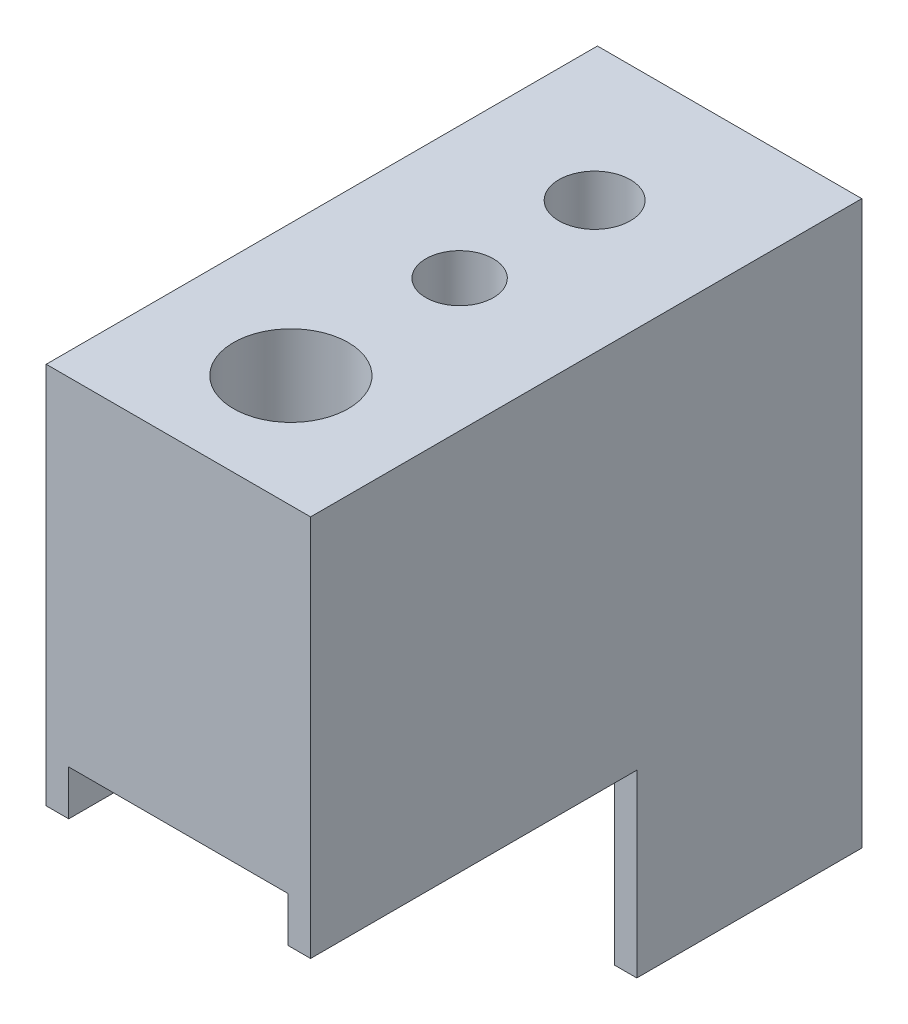
ISO-10303-21;
HEADER;
FILE_DESCRIPTION(('STEP AP214'),'2;1');
FILE_NAME('part.step','',(''),(''),'','','');
FILE_SCHEMA(('AUTOMOTIVE_DESIGN { 1 0 10303 214 1 1 1 1 }'));
ENDSEC;
DATA;
#1=APPLICATION_CONTEXT('core data for automotive mechanical design processes');
#2=APPLICATION_PROTOCOL_DEFINITION('international standard','automotive_design',2000,#1);
#3=PRODUCT_CONTEXT('',#1,'mechanical');
#4=PRODUCT('Part','Part','',(#3));
#5=PRODUCT_RELATED_PRODUCT_CATEGORY('part','',(#4));
#6=PRODUCT_DEFINITION_FORMATION('','',#4);
#7=PRODUCT_DEFINITION_CONTEXT('part definition',#1,'design');
#8=PRODUCT_DEFINITION('design','',#6,#7);
#9=PRODUCT_DEFINITION_SHAPE('','',#8);
#10=(LENGTH_UNIT() NAMED_UNIT(*) SI_UNIT(.MILLI.,.METRE.));
#11=(NAMED_UNIT(*) PLANE_ANGLE_UNIT() SI_UNIT($,.RADIAN.));
#12=(NAMED_UNIT(*) SI_UNIT($,.STERADIAN.) SOLID_ANGLE_UNIT());
#13=UNCERTAINTY_MEASURE_WITH_UNIT(LENGTH_MEASURE(1.E-05),#10,'distance_accuracy_value','');
#14=(GEOMETRIC_REPRESENTATION_CONTEXT(3) GLOBAL_UNCERTAINTY_ASSIGNED_CONTEXT((#13)) GLOBAL_UNIT_ASSIGNED_CONTEXT((#10,
#11,#12)) REPRESENTATION_CONTEXT('',''));
#15=CARTESIAN_POINT('',(0.,0.,0.));
#16=DIRECTION('',(0.,0.,1.));
#17=DIRECTION('',(1.,0.,0.));
#18=AXIS2_PLACEMENT_3D('',#15,#16,#17);
#19=CARTESIAN_POINT('',(9.75,0.,44.));
#20=DIRECTION('',(0.,0.,-1.));
#21=DIRECTION('',(-1.,0.,0.));
#22=AXIS2_PLACEMENT_3D('',#19,#20,#21);
#23=PLANE('',#22);
#24=DIRECTION('',(-1.,0.,0.));
#25=VECTOR('',#24,1.);
#26=CARTESIAN_POINT('',(9.75,30.,44.));
#27=LINE('',#26,#25);
#28=CARTESIAN_POINT('',(11.75,30.,44.));
#29=VERTEX_POINT('',#28);
#30=CARTESIAN_POINT('',(-11.75,30.,44.));
#31=VERTEX_POINT('',#30);
#32=EDGE_CURVE('E142',#29,#31,#27,.T.);
#33=ORIENTED_EDGE('',*,*,#32,.T.);
#34=DIRECTION('',(0.,-1.,0.));
#35=VECTOR('',#34,1.);
#36=CARTESIAN_POINT('',(-11.75,30.,44.));
#37=LINE('',#36,#35);
#38=CARTESIAN_POINT('',(-11.75,-4.,44.));
#39=VERTEX_POINT('',#38);
#40=EDGE_CURVE('E134',#31,#39,#37,.T.);
#41=ORIENTED_EDGE('',*,*,#40,.T.);
#42=DIRECTION('',(1.,0.,0.));
#43=VECTOR('',#42,1.);
#44=CARTESIAN_POINT('',(-11.75,-4.,44.));
#45=LINE('',#44,#43);
#46=CARTESIAN_POINT('',(-9.75,-4.,44.));
#47=VERTEX_POINT('',#46);
#48=EDGE_CURVE('E117',#39,#47,#45,.T.);
#49=ORIENTED_EDGE('',*,*,#48,.T.);
#50=DIRECTION('',(0.,-1.,0.));
#51=VECTOR('',#50,1.);
#52=CARTESIAN_POINT('',(-9.75,30.,44.));
#53=LINE('',#52,#51);
#54=CARTESIAN_POINT('',(-9.75,0.,44.));
#55=VERTEX_POINT('',#54);
#56=EDGE_CURVE('E157',#55,#47,#53,.T.);
#57=ORIENTED_EDGE('',*,*,#56,.F.);
#58=DIRECTION('',(-1.,0.,0.));
#59=VECTOR('',#58,1.);
#60=CARTESIAN_POINT('',(9.75,0.,44.));
#61=LINE('',#60,#59);
#62=CARTESIAN_POINT('',(9.75,0.,44.));
#63=VERTEX_POINT('',#62);
#64=EDGE_CURVE('E11',#63,#55,#61,.T.);
#65=ORIENTED_EDGE('',*,*,#64,.F.);
#66=DIRECTION('',(0.,-1.,0.));
#67=VECTOR('',#66,1.);
#68=CARTESIAN_POINT('',(9.75,30.,44.));
#69=LINE('',#68,#67);
#70=CARTESIAN_POINT('',(9.75,-4.,44.));
#71=VERTEX_POINT('',#70);
#72=EDGE_CURVE('E170',#63,#71,#69,.T.);
#73=ORIENTED_EDGE('',*,*,#72,.T.);
#74=DIRECTION('',(-1.,0.,0.));
#75=VECTOR('',#74,1.);
#76=CARTESIAN_POINT('',(11.75,-4.,44.));
#77=LINE('',#76,#75);
#78=CARTESIAN_POINT('',(11.75,-4.,44.));
#79=VERTEX_POINT('',#78);
#80=EDGE_CURVE('E183',#79,#71,#77,.T.);
#81=ORIENTED_EDGE('',*,*,#80,.F.);
#82=DIRECTION('',(0.,-1.,0.));
#83=VECTOR('',#82,1.);
#84=CARTESIAN_POINT('',(11.75,30.,44.));
#85=LINE('',#84,#83);
#86=EDGE_CURVE('E181',#29,#79,#85,.T.);
#87=ORIENTED_EDGE('',*,*,#86,.F.);
#88=EDGE_LOOP('',(#33,#41,#49,#57,#65,#73,#81,#87));
#89=FACE_BOUND('',#88,.T.);
#90=ADVANCED_FACE('F33',(#89),#23,.F.);
#91=CARTESIAN_POINT('',(9.75,0.,44.));
#92=DIRECTION('',(0.,1.,0.));
#93=DIRECTION('',(0.,0.,1.));
#94=AXIS2_PLACEMENT_3D('',#91,#92,#93);
#95=PLANE('',#94);
#96=CARTESIAN_POINT('',(0.,0.,34.));
#97=DIRECTION('',(0.,-1.,0.));
#98=DIRECTION('',(0.,0.,-1.));
#99=AXIS2_PLACEMENT_3D('',#96,#97,#98);
#100=CIRCLE('',#99,5.1);
#101=CARTESIAN_POINT('',(0.,0.,28.9));
#102=VERTEX_POINT('',#101);
#103=EDGE_CURVE('E369',#102,#102,#100,.T.);
#104=ORIENTED_EDGE('',*,*,#103,.F.);
#105=EDGE_LOOP('',(#104));
#106=FACE_BOUND('',#105,.T.);
#107=CARTESIAN_POINT('',(0.,0.,19.));
#108=DIRECTION('',(0.,-1.,0.));
#109=DIRECTION('',(0.,0.,-1.));
#110=AXIS2_PLACEMENT_3D('',#107,#108,#109);
#111=CIRCLE('',#110,3.);
#112=CARTESIAN_POINT('',(0.,0.,16.));
#113=VERTEX_POINT('',#112);
#114=EDGE_CURVE('E374',#113,#113,#111,.T.);
#115=ORIENTED_EDGE('',*,*,#114,.F.);
#116=EDGE_LOOP('',(#115));
#117=FACE_BOUND('',#116,.T.);
#118=CARTESIAN_POINT('',(0.,0.,7.));
#119=DIRECTION('',(0.,-1.,0.));
#120=DIRECTION('',(0.,0.,-1.));
#121=AXIS2_PLACEMENT_3D('',#118,#119,#120);
#122=CIRCLE('',#121,3.175);
#123=CARTESIAN_POINT('',(0.,0.,3.825));
#124=VERTEX_POINT('',#123);
#125=EDGE_CURVE('E381',#124,#124,#122,.T.);
#126=ORIENTED_EDGE('',*,*,#125,.F.);
#127=EDGE_LOOP('',(#126));
#128=FACE_BOUND('',#127,.T.);
#129=DIRECTION('',(0.,0.,-1.));
#130=VECTOR('',#129,1.);
#131=CARTESIAN_POINT('',(-9.75,0.,44.));
#132=LINE('',#131,#130);
#133=CARTESIAN_POINT('',(-9.75,0.,0.));
#134=VERTEX_POINT('',#133);
#135=EDGE_CURVE('E200',#55,#134,#132,.T.);
#136=ORIENTED_EDGE('',*,*,#135,.T.);
#137=DIRECTION('',(-1.,0.,0.));
#138=VECTOR('',#137,1.);
#139=CARTESIAN_POINT('',(9.75,0.,0.));
#140=LINE('',#139,#138);
#141=CARTESIAN_POINT('',(9.75,0.,0.));
#142=VERTEX_POINT('',#141);
#143=EDGE_CURVE('E41',#142,#134,#140,.T.);
#144=ORIENTED_EDGE('',*,*,#143,.F.);
#145=DIRECTION('',(0.,0.,-1.));
#146=VECTOR('',#145,1.);
#147=CARTESIAN_POINT('',(9.75,0.,44.));
#148=LINE('',#147,#146);
#149=EDGE_CURVE('E201',#63,#142,#148,.T.);
#150=ORIENTED_EDGE('',*,*,#149,.F.);
#151=ORIENTED_EDGE('',*,*,#64,.T.);
#152=EDGE_LOOP('',(#136,#144,#150,#151));
#153=FACE_BOUND('',#152,.T.);
#154=ADVANCED_FACE('F224',(#106,#117,#128,#153),#95,.F.);
#155=CARTESIAN_POINT('',(9.75,0.,0.));
#156=DIRECTION('',(0.,0.,-1.));
#157=DIRECTION('',(0.,1.,0.));
#158=AXIS2_PLACEMENT_3D('',#155,#156,#157);
#159=PLANE('',#158);
#160=DIRECTION('',(0.,-1.,0.));
#161=VECTOR('',#160,1.);
#162=CARTESIAN_POINT('',(-9.75,0.,0.));
#163=LINE('',#162,#161);
#164=CARTESIAN_POINT('',(-9.75,-20.,0.));
#165=VERTEX_POINT('',#164);
#166=EDGE_CURVE('E205',#134,#165,#163,.T.);
#167=ORIENTED_EDGE('',*,*,#166,.T.);
#168=DIRECTION('',(-1.,0.,0.));
#169=VECTOR('',#168,1.);
#170=CARTESIAN_POINT('',(9.75,-20.,0.));
#171=LINE('',#170,#169);
#172=CARTESIAN_POINT('',(9.75,-20.,0.));
#173=VERTEX_POINT('',#172);
#174=EDGE_CURVE('E216',#173,#165,#171,.T.);
#175=ORIENTED_EDGE('',*,*,#174,.F.);
#176=DIRECTION('',(0.,-1.,0.));
#177=VECTOR('',#176,1.);
#178=CARTESIAN_POINT('',(9.75,0.,0.));
#179=LINE('',#178,#177);
#180=EDGE_CURVE('E204',#142,#173,#179,.T.);
#181=ORIENTED_EDGE('',*,*,#180,.F.);
#182=ORIENTED_EDGE('',*,*,#143,.T.);
#183=EDGE_LOOP('',(#167,#175,#181,#182));
#184=FACE_BOUND('',#183,.T.);
#185=ADVANCED_FACE('F219',(#184),#159,.F.);
#186=CARTESIAN_POINT('',(9.75,-20.,-5.));
#187=DIRECTION('',(0.,1.,0.));
#188=DIRECTION('',(0.,0.,1.));
#189=AXIS2_PLACEMENT_3D('',#186,#187,#188);
#190=PLANE('',#189);
#191=ORIENTED_EDGE('',*,*,#174,.T.);
#192=DIRECTION('',(0.,0.,-1.));
#193=VECTOR('',#192,1.);
#194=CARTESIAN_POINT('',(-9.75,-20.,14.9999999999721));
#195=LINE('',#194,#193);
#196=CARTESIAN_POINT('',(-9.75,-20.,14.9999999999721));
#197=VERTEX_POINT('',#196);
#198=EDGE_CURVE('E160',#197,#165,#195,.T.);
#199=ORIENTED_EDGE('',*,*,#198,.F.);
#200=DIRECTION('',(1.,0.,0.));
#201=VECTOR('',#200,1.);
#202=CARTESIAN_POINT('',(-11.75,-20.,14.9999999999721));
#203=LINE('',#202,#201);
#204=CARTESIAN_POINT('',(-11.75,-20.,14.9999999999721));
#205=VERTEX_POINT('',#204);
#206=EDGE_CURVE('E128',#205,#197,#203,.T.);
#207=ORIENTED_EDGE('',*,*,#206,.F.);
#208=DIRECTION('',(0.,0.,-1.));
#209=VECTOR('',#208,1.);
#210=CARTESIAN_POINT('',(-11.75,-20.,14.9999999999721));
#211=LINE('',#210,#209);
#212=CARTESIAN_POINT('',(-11.75,-20.,-5.));
#213=VERTEX_POINT('',#212);
#214=EDGE_CURVE('E151',#205,#213,#211,.T.);
#215=ORIENTED_EDGE('',*,*,#214,.T.);
#216=DIRECTION('',(-1.,0.,0.));
#217=VECTOR('',#216,1.);
#218=CARTESIAN_POINT('',(9.75,-20.,-5.));
#219=LINE('',#218,#217);
#220=CARTESIAN_POINT('',(11.75,-20.,-5.));
#221=VERTEX_POINT('',#220);
#222=EDGE_CURVE('E214',#221,#213,#219,.T.);
#223=ORIENTED_EDGE('',*,*,#222,.F.);
#224=DIRECTION('',(0.,0.,-1.));
#225=VECTOR('',#224,1.);
#226=CARTESIAN_POINT('',(11.75,-20.,14.9999999999721));
#227=LINE('',#226,#225);
#228=CARTESIAN_POINT('',(11.75,-20.,14.9999999999721));
#229=VERTEX_POINT('',#228);
#230=EDGE_CURVE('E172',#229,#221,#227,.T.);
#231=ORIENTED_EDGE('',*,*,#230,.F.);
#232=DIRECTION('',(-1.,0.,0.));
#233=VECTOR('',#232,1.);
#234=CARTESIAN_POINT('',(11.75,-20.,14.9999999999721));
#235=LINE('',#234,#233);
#236=CARTESIAN_POINT('',(9.75,-20.,14.9999999999721));
#237=VERTEX_POINT('',#236);
#238=EDGE_CURVE('E194',#229,#237,#235,.T.);
#239=ORIENTED_EDGE('',*,*,#238,.T.);
#240=DIRECTION('',(0.,0.,-1.));
#241=VECTOR('',#240,1.);
#242=CARTESIAN_POINT('',(9.75,-20.,14.9999999999721));
#243=LINE('',#242,#241);
#244=EDGE_CURVE('E188',#237,#173,#243,.T.);
#245=ORIENTED_EDGE('',*,*,#244,.T.);
#246=EDGE_LOOP('',(#191,#199,#207,#215,#223,#231,#239,#245));
#247=FACE_BOUND('',#246,.T.);
#248=ADVANCED_FACE('F247',(#247),#190,.F.);
#249=CARTESIAN_POINT('',(9.75,30.,-5.));
#250=DIRECTION('',(0.,0.,1.));
#251=DIRECTION('',(0.,-1.,0.));
#252=AXIS2_PLACEMENT_3D('',#249,#250,#251);
#253=PLANE('',#252);
#254=ORIENTED_EDGE('',*,*,#222,.T.);
#255=DIRECTION('',(0.,1.,0.));
#256=VECTOR('',#255,1.);
#257=CARTESIAN_POINT('',(-11.75,30.,-5.));
#258=LINE('',#257,#256);
#259=CARTESIAN_POINT('',(-11.75,30.,-5.));
#260=VERTEX_POINT('',#259);
#261=EDGE_CURVE('E145',#213,#260,#258,.T.);
#262=ORIENTED_EDGE('',*,*,#261,.T.);
#263=DIRECTION('',(-1.,0.,0.));
#264=VECTOR('',#263,1.);
#265=CARTESIAN_POINT('',(9.75,30.,-5.));
#266=LINE('',#265,#264);
#267=CARTESIAN_POINT('',(11.75,30.,-5.));
#268=VERTEX_POINT('',#267);
#269=EDGE_CURVE('E212',#268,#260,#266,.T.);
#270=ORIENTED_EDGE('',*,*,#269,.F.);
#271=DIRECTION('',(0.,1.,0.));
#272=VECTOR('',#271,1.);
#273=CARTESIAN_POINT('',(11.75,30.,-5.));
#274=LINE('',#273,#272);
#275=EDGE_CURVE('E175',#221,#268,#274,.T.);
#276=ORIENTED_EDGE('',*,*,#275,.F.);
#277=EDGE_LOOP('',(#254,#262,#270,#276));
#278=FACE_BOUND('',#277,.T.);
#279=ADVANCED_FACE('F244',(#278),#253,.F.);
#280=CARTESIAN_POINT('',(9.75,30.,44.));
#281=DIRECTION('',(0.,-1.,0.));
#282=DIRECTION('',(0.,0.,-1.));
#283=AXIS2_PLACEMENT_3D('',#280,#281,#282);
#284=PLANE('',#283);
#285=CARTESIAN_POINT('',(0.,30.,34.));
#286=DIRECTION('',(0.,-1.,0.));
#287=DIRECTION('',(0.,0.,-1.));
#288=AXIS2_PLACEMENT_3D('',#285,#286,#287);
#289=CIRCLE('',#288,5.1);
#290=CARTESIAN_POINT('',(0.,30.,28.9));
#291=VERTEX_POINT('',#290);
#292=EDGE_CURVE('E158',#291,#291,#289,.T.);
#293=ORIENTED_EDGE('',*,*,#292,.T.);
#294=EDGE_LOOP('',(#293));
#295=FACE_BOUND('',#294,.T.);
#296=CARTESIAN_POINT('',(0.,30.,19.));
#297=DIRECTION('',(0.,-1.,0.));
#298=DIRECTION('',(0.,0.,-1.));
#299=AXIS2_PLACEMENT_3D('',#296,#297,#298);
#300=CIRCLE('',#299,3.);
#301=CARTESIAN_POINT('',(0.,30.,16.));
#302=VERTEX_POINT('',#301);
#303=EDGE_CURVE('E370',#302,#302,#300,.T.);
#304=ORIENTED_EDGE('',*,*,#303,.T.);
#305=EDGE_LOOP('',(#304));
#306=FACE_BOUND('',#305,.T.);
#307=CARTESIAN_POINT('',(0.,30.,7.));
#308=DIRECTION('',(0.,-1.,0.));
#309=DIRECTION('',(0.,0.,-1.));
#310=AXIS2_PLACEMENT_3D('',#307,#308,#309);
#311=CIRCLE('',#310,3.175);
#312=CARTESIAN_POINT('',(0.,30.,3.825));
#313=VERTEX_POINT('',#312);
#314=EDGE_CURVE('E379',#313,#313,#311,.T.);
#315=ORIENTED_EDGE('',*,*,#314,.T.);
#316=EDGE_LOOP('',(#315));
#317=FACE_BOUND('',#316,.T.);
#318=ORIENTED_EDGE('',*,*,#269,.T.);
#319=DIRECTION('',(0.,0.,1.));
#320=VECTOR('',#319,1.);
#321=CARTESIAN_POINT('',(-11.75,30.,44.));
#322=LINE('',#321,#320);
#323=EDGE_CURVE('E143',#260,#31,#322,.T.);
#324=ORIENTED_EDGE('',*,*,#323,.T.);
#325=ORIENTED_EDGE('',*,*,#32,.F.);
#326=DIRECTION('',(0.,0.,1.));
#327=VECTOR('',#326,1.);
#328=CARTESIAN_POINT('',(11.75,30.,44.));
#329=LINE('',#328,#327);
#330=EDGE_CURVE('E178',#268,#29,#329,.T.);
#331=ORIENTED_EDGE('',*,*,#330,.F.);
#332=EDGE_LOOP('',(#318,#324,#325,#331));
#333=FACE_BOUND('',#332,.T.);
#334=ADVANCED_FACE('F241',(#295,#306,#317,#333),#284,.F.);
#335=CARTESIAN_POINT('',(11.75,-4.,44.));
#336=DIRECTION('',(0.,1.,0.));
#337=DIRECTION('',(0.,0.,1.));
#338=AXIS2_PLACEMENT_3D('',#335,#336,#337);
#339=PLANE('',#338);
#340=DIRECTION('',(0.,0.,-1.));
#341=VECTOR('',#340,1.);
#342=CARTESIAN_POINT('',(9.75,-4.,44.));
#343=LINE('',#342,#341);
#344=CARTESIAN_POINT('',(9.75,-4.,14.9999999999721));
#345=VERTEX_POINT('',#344);
#346=EDGE_CURVE('E127',#71,#345,#343,.T.);
#347=ORIENTED_EDGE('',*,*,#346,.T.);
#348=DIRECTION('',(-1.,0.,0.));
#349=VECTOR('',#348,1.);
#350=CARTESIAN_POINT('',(11.75,-4.,14.9999999999721));
#351=LINE('',#350,#349);
#352=CARTESIAN_POINT('',(11.75,-4.,14.9999999999721));
#353=VERTEX_POINT('',#352);
#354=EDGE_CURVE('E197',#353,#345,#351,.T.);
#355=ORIENTED_EDGE('',*,*,#354,.F.);
#356=DIRECTION('',(0.,0.,-1.));
#357=VECTOR('',#356,1.);
#358=CARTESIAN_POINT('',(11.75,-4.,44.));
#359=LINE('',#358,#357);
#360=EDGE_CURVE('E166',#79,#353,#359,.T.);
#361=ORIENTED_EDGE('',*,*,#360,.F.);
#362=ORIENTED_EDGE('',*,*,#80,.T.);
#363=EDGE_LOOP('',(#347,#355,#361,#362));
#364=FACE_BOUND('',#363,.T.);
#365=ADVANCED_FACE('F234',(#364),#339,.F.);
#366=CARTESIAN_POINT('',(11.75,-4.,14.9999999999721));
#367=DIRECTION('',(0.,0.,-1.));
#368=DIRECTION('',(0.,1.,0.));
#369=AXIS2_PLACEMENT_3D('',#366,#367,#368);
#370=PLANE('',#369);
#371=DIRECTION('',(0.,-1.,0.));
#372=VECTOR('',#371,1.);
#373=CARTESIAN_POINT('',(9.75,-4.,14.9999999999721));
#374=LINE('',#373,#372);
#375=EDGE_CURVE('E186',#345,#237,#374,.T.);
#376=ORIENTED_EDGE('',*,*,#375,.T.);
#377=ORIENTED_EDGE('',*,*,#238,.F.);
#378=DIRECTION('',(0.,-1.,0.));
#379=VECTOR('',#378,1.);
#380=CARTESIAN_POINT('',(11.75,-4.,14.9999999999721));
#381=LINE('',#380,#379);
#382=EDGE_CURVE('E169',#353,#229,#381,.T.);
#383=ORIENTED_EDGE('',*,*,#382,.F.);
#384=ORIENTED_EDGE('',*,*,#354,.T.);
#385=EDGE_LOOP('',(#376,#377,#383,#384));
#386=FACE_BOUND('',#385,.T.);
#387=ADVANCED_FACE('F250',(#386),#370,.F.);
#388=CARTESIAN_POINT('',(11.75,0.,0.));
#389=DIRECTION('',(-1.,0.,0.));
#390=DIRECTION('',(0.,0.,1.));
#391=AXIS2_PLACEMENT_3D('',#388,#389,#390);
#392=PLANE('',#391);
#393=ORIENTED_EDGE('',*,*,#360,.T.);
#394=ORIENTED_EDGE('',*,*,#382,.T.);
#395=ORIENTED_EDGE('',*,*,#230,.T.);
#396=ORIENTED_EDGE('',*,*,#275,.T.);
#397=ORIENTED_EDGE('',*,*,#330,.T.);
#398=ORIENTED_EDGE('',*,*,#86,.T.);
#399=EDGE_LOOP('',(#393,#394,#395,#396,#397,#398));
#400=FACE_BOUND('',#399,.T.);
#401=ADVANCED_FACE('F237',(#400),#392,.F.);
#402=CARTESIAN_POINT('',(9.75,0.,0.));
#403=DIRECTION('',(-1.,0.,0.));
#404=DIRECTION('',(0.,0.,1.));
#405=AXIS2_PLACEMENT_3D('',#402,#403,#404);
#406=PLANE('',#405);
#407=ORIENTED_EDGE('',*,*,#72,.F.);
#408=ORIENTED_EDGE('',*,*,#149,.T.);
#409=ORIENTED_EDGE('',*,*,#180,.T.);
#410=ORIENTED_EDGE('',*,*,#244,.F.);
#411=ORIENTED_EDGE('',*,*,#375,.F.);
#412=ORIENTED_EDGE('',*,*,#346,.F.);
#413=EDGE_LOOP('',(#407,#408,#409,#410,#411,#412));
#414=FACE_BOUND('',#413,.T.);
#415=ADVANCED_FACE('F230',(#414),#406,.T.);
#416=CARTESIAN_POINT('',(-9.75,0.,0.));
#417=DIRECTION('',(1.,0.,0.));
#418=DIRECTION('',(0.,0.,1.));
#419=AXIS2_PLACEMENT_3D('',#416,#417,#418);
#420=PLANE('',#419);
#421=ORIENTED_EDGE('',*,*,#166,.F.);
#422=ORIENTED_EDGE('',*,*,#135,.F.);
#423=ORIENTED_EDGE('',*,*,#56,.T.);
#424=DIRECTION('',(0.,0.,-1.));
#425=VECTOR('',#424,1.);
#426=CARTESIAN_POINT('',(-9.75,-4.,44.));
#427=LINE('',#426,#425);
#428=CARTESIAN_POINT('',(-9.75,-4.,14.9999999999721));
#429=VERTEX_POINT('',#428);
#430=EDGE_CURVE('E123',#47,#429,#427,.T.);
#431=ORIENTED_EDGE('',*,*,#430,.T.);
#432=DIRECTION('',(0.,-1.,0.));
#433=VECTOR('',#432,1.);
#434=CARTESIAN_POINT('',(-9.75,-4.,14.9999999999721));
#435=LINE('',#434,#433);
#436=EDGE_CURVE('E139',#429,#197,#435,.T.);
#437=ORIENTED_EDGE('',*,*,#436,.T.);
#438=ORIENTED_EDGE('',*,*,#198,.T.);
#439=EDGE_LOOP('',(#421,#422,#423,#431,#437,#438));
#440=FACE_BOUND('',#439,.T.);
#441=ADVANCED_FACE('F222',(#440),#420,.T.);
#442=CARTESIAN_POINT('',(-11.75,-4.,44.));
#443=DIRECTION('',(0.,-1.,0.));
#444=DIRECTION('',(0.,0.,-1.));
#445=AXIS2_PLACEMENT_3D('',#442,#443,#444);
#446=PLANE('',#445);
#447=ORIENTED_EDGE('',*,*,#430,.F.);
#448=ORIENTED_EDGE('',*,*,#48,.F.);
#449=DIRECTION('',(0.,0.,-1.));
#450=VECTOR('',#449,1.);
#451=CARTESIAN_POINT('',(-11.75,-4.,44.));
#452=LINE('',#451,#450);
#453=CARTESIAN_POINT('',(-11.75,-4.,14.9999999999721));
#454=VERTEX_POINT('',#453);
#455=EDGE_CURVE('E120',#39,#454,#452,.T.);
#456=ORIENTED_EDGE('',*,*,#455,.T.);
#457=DIRECTION('',(1.,0.,0.));
#458=VECTOR('',#457,1.);
#459=CARTESIAN_POINT('',(-11.75,-4.,14.9999999999721));
#460=LINE('',#459,#458);
#461=EDGE_CURVE('E155',#454,#429,#460,.T.);
#462=ORIENTED_EDGE('',*,*,#461,.T.);
#463=EDGE_LOOP('',(#447,#448,#456,#462));
#464=FACE_BOUND('',#463,.T.);
#465=ADVANCED_FACE('F119',(#464),#446,.T.);
#466=CARTESIAN_POINT('',(-11.75,-4.,14.9999999999721));
#467=DIRECTION('',(0.,0.,1.));
#468=DIRECTION('',(0.,-1.,0.));
#469=AXIS2_PLACEMENT_3D('',#466,#467,#468);
#470=PLANE('',#469);
#471=ORIENTED_EDGE('',*,*,#436,.F.);
#472=ORIENTED_EDGE('',*,*,#461,.F.);
#473=DIRECTION('',(0.,-1.,0.));
#474=VECTOR('',#473,1.);
#475=CARTESIAN_POINT('',(-11.75,-4.,14.9999999999721));
#476=LINE('',#475,#474);
#477=EDGE_CURVE('E138',#454,#205,#476,.T.);
#478=ORIENTED_EDGE('',*,*,#477,.T.);
#479=ORIENTED_EDGE('',*,*,#206,.T.);
#480=EDGE_LOOP('',(#471,#472,#478,#479));
#481=FACE_BOUND('',#480,.T.);
#482=ADVANCED_FACE('F253',(#481),#470,.T.);
#483=CARTESIAN_POINT('',(-11.75,0.,0.));
#484=DIRECTION('',(1.,0.,0.));
#485=DIRECTION('',(0.,0.,1.));
#486=AXIS2_PLACEMENT_3D('',#483,#484,#485);
#487=PLANE('',#486);
#488=ORIENTED_EDGE('',*,*,#455,.F.);
#489=ORIENTED_EDGE('',*,*,#40,.F.);
#490=ORIENTED_EDGE('',*,*,#323,.F.);
#491=ORIENTED_EDGE('',*,*,#261,.F.);
#492=ORIENTED_EDGE('',*,*,#214,.F.);
#493=ORIENTED_EDGE('',*,*,#477,.F.);
#494=EDGE_LOOP('',(#488,#489,#490,#491,#492,#493));
#495=FACE_BOUND('',#494,.T.);
#496=ADVANCED_FACE('F132',(#495),#487,.F.);
#497=CARTESIAN_POINT('',(0.,30.,7.));
#498=DIRECTION('',(0.,-1.,0.));
#499=DIRECTION('',(0.,0.,-1.));
#500=AXIS2_PLACEMENT_3D('',#497,#498,#499);
#501=CYLINDRICAL_SURFACE('',#500,3.175);
#502=ORIENTED_EDGE('',*,*,#314,.F.);
#503=EDGE_LOOP('',(#502));
#504=FACE_BOUND('',#503,.T.);
#505=ORIENTED_EDGE('',*,*,#125,.T.);
#506=EDGE_LOOP('',(#505));
#507=FACE_BOUND('',#506,.T.);
#508=ADVANCED_FACE('F260',(#504,#507),#501,.F.);
#509=CARTESIAN_POINT('',(0.,30.,19.));
#510=DIRECTION('',(0.,-1.,0.));
#511=DIRECTION('',(0.,0.,-1.));
#512=AXIS2_PLACEMENT_3D('',#509,#510,#511);
#513=CYLINDRICAL_SURFACE('',#512,3.);
#514=ORIENTED_EDGE('',*,*,#303,.F.);
#515=EDGE_LOOP('',(#514));
#516=FACE_BOUND('',#515,.T.);
#517=ORIENTED_EDGE('',*,*,#114,.T.);
#518=EDGE_LOOP('',(#517));
#519=FACE_BOUND('',#518,.T.);
#520=ADVANCED_FACE('F341',(#516,#519),#513,.F.);
#521=CARTESIAN_POINT('',(0.,30.,34.));
#522=DIRECTION('',(0.,-1.,0.));
#523=DIRECTION('',(0.,0.,-1.));
#524=AXIS2_PLACEMENT_3D('',#521,#522,#523);
#525=CYLINDRICAL_SURFACE('',#524,5.1);
#526=ORIENTED_EDGE('',*,*,#292,.F.);
#527=EDGE_LOOP('',(#526));
#528=FACE_BOUND('',#527,.T.);
#529=ORIENTED_EDGE('',*,*,#103,.T.);
#530=EDGE_LOOP('',(#529));
#531=FACE_BOUND('',#530,.T.);
#532=ADVANCED_FACE('F351',(#528,#531),#525,.F.);
#533=CLOSED_SHELL('',(#90,#154,#185,#248,#279,#334,#365,#387,#401,#415,#441,#465,#482,#496,#508,
#520,#532));
#534=MANIFOLD_SOLID_BREP('B2',#533);
#535=ADVANCED_BREP_SHAPE_REPRESENTATION('',(#18,#534),#14);
#536=SHAPE_DEFINITION_REPRESENTATION(#9,#535);
ENDSEC;
END-ISO-10303-21;
